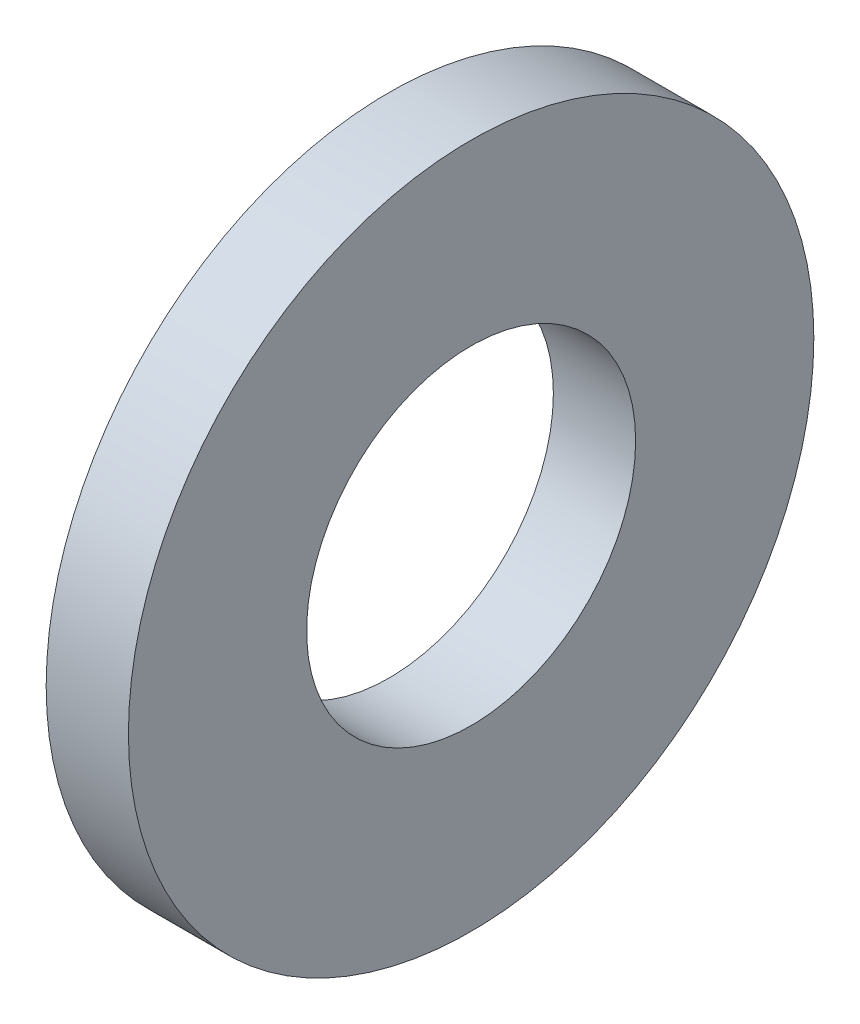
ISO-10303-21;
HEADER;
FILE_DESCRIPTION(('STEP AP214'),'2;1');
FILE_NAME('part.step','',(''),(''),'','','');
FILE_SCHEMA(('AUTOMOTIVE_DESIGN { 1 0 10303 214 1 1 1 1 }'));
ENDSEC;
DATA;
#1=APPLICATION_CONTEXT('core data for automotive mechanical design processes');
#2=APPLICATION_PROTOCOL_DEFINITION('international standard','automotive_design',2000,#1);
#3=PRODUCT_CONTEXT('',#1,'mechanical');
#4=PRODUCT('Part','Part','',(#3));
#5=PRODUCT_RELATED_PRODUCT_CATEGORY('part','',(#4));
#6=PRODUCT_DEFINITION_FORMATION('','',#4);
#7=PRODUCT_DEFINITION_CONTEXT('part definition',#1,'design');
#8=PRODUCT_DEFINITION('design','',#6,#7);
#9=PRODUCT_DEFINITION_SHAPE('','',#8);
#10=(LENGTH_UNIT() NAMED_UNIT(*) SI_UNIT(.MILLI.,.METRE.));
#11=(NAMED_UNIT(*) PLANE_ANGLE_UNIT() SI_UNIT($,.RADIAN.));
#12=(NAMED_UNIT(*) SI_UNIT($,.STERADIAN.) SOLID_ANGLE_UNIT());
#13=UNCERTAINTY_MEASURE_WITH_UNIT(LENGTH_MEASURE(1.E-05),#10,'distance_accuracy_value','');
#14=(GEOMETRIC_REPRESENTATION_CONTEXT(3) GLOBAL_UNCERTAINTY_ASSIGNED_CONTEXT((#13)) GLOBAL_UNIT_ASSIGNED_CONTEXT((#10,
#11,#12)) REPRESENTATION_CONTEXT('',''));
#15=CARTESIAN_POINT('',(0.,0.,0.));
#16=DIRECTION('',(0.,0.,1.));
#17=DIRECTION('',(1.,0.,0.));
#18=AXIS2_PLACEMENT_3D('',#15,#16,#17);
#19=CARTESIAN_POINT('',(3.,0.,0.));
#20=DIRECTION('',(1.,0.,0.));
#21=DIRECTION('',(0.,0.,-1.));
#22=AXIS2_PLACEMENT_3D('',#19,#20,#21);
#23=PLANE('',#22);
#24=CARTESIAN_POINT('',(3.,0.,0.));
#25=DIRECTION('',(1.,0.,0.));
#26=DIRECTION('',(0.,0.,-1.));
#27=AXIS2_PLACEMENT_3D('',#24,#25,#26);
#28=CIRCLE('',#27,12.5);
#29=CARTESIAN_POINT('',(3.,0.,-12.5));
#30=VERTEX_POINT('',#29);
#31=EDGE_CURVE('E10',#30,#30,#28,.T.);
#32=ORIENTED_EDGE('',*,*,#31,.T.);
#33=EDGE_LOOP('',(#32));
#34=FACE_BOUND('',#33,.T.);
#35=CARTESIAN_POINT('',(3.,0.,0.));
#36=DIRECTION('',(1.,0.,0.));
#37=DIRECTION('',(0.,0.,-1.));
#38=AXIS2_PLACEMENT_3D('',#35,#36,#37);
#39=CIRCLE('',#38,6.);
#40=CARTESIAN_POINT('',(3.,0.,-6.));
#41=VERTEX_POINT('',#40);
#42=EDGE_CURVE('E42',#41,#41,#39,.T.);
#43=ORIENTED_EDGE('',*,*,#42,.F.);
#44=EDGE_LOOP('',(#43));
#45=FACE_BOUND('',#44,.T.);
#46=ADVANCED_FACE('F31',(#34,#45),#23,.T.);
#47=CARTESIAN_POINT('',(0.,0.,0.));
#48=DIRECTION('',(1.,0.,0.));
#49=DIRECTION('',(0.,0.,-1.));
#50=AXIS2_PLACEMENT_3D('',#47,#48,#49);
#51=PLANE('',#50);
#52=CARTESIAN_POINT('',(0.,0.,0.));
#53=DIRECTION('',(1.,0.,0.));
#54=DIRECTION('',(0.,0.,-1.));
#55=AXIS2_PLACEMENT_3D('',#52,#53,#54);
#56=CIRCLE('',#55,12.5);
#57=CARTESIAN_POINT('',(0.,0.,-12.5));
#58=VERTEX_POINT('',#57);
#59=EDGE_CURVE('E35',#58,#58,#56,.T.);
#60=ORIENTED_EDGE('',*,*,#59,.F.);
#61=EDGE_LOOP('',(#60));
#62=FACE_BOUND('',#61,.T.);
#63=CARTESIAN_POINT('',(0.,0.,0.));
#64=DIRECTION('',(1.,0.,0.));
#65=DIRECTION('',(0.,0.,-1.));
#66=AXIS2_PLACEMENT_3D('',#63,#64,#65);
#67=CIRCLE('',#66,6.);
#68=CARTESIAN_POINT('',(0.,0.,-6.));
#69=VERTEX_POINT('',#68);
#70=EDGE_CURVE('E44',#69,#69,#67,.T.);
#71=ORIENTED_EDGE('',*,*,#70,.T.);
#72=EDGE_LOOP('',(#71));
#73=FACE_BOUND('',#72,.T.);
#74=ADVANCED_FACE('F54',(#62,#73),#51,.F.);
#75=CARTESIAN_POINT('',(3.,0.,0.));
#76=DIRECTION('',(-1.,0.,0.));
#77=DIRECTION('',(0.,0.,1.));
#78=AXIS2_PLACEMENT_3D('',#75,#76,#77);
#79=CYLINDRICAL_SURFACE('',#78,12.5);
#80=ORIENTED_EDGE('',*,*,#31,.F.);
#81=EDGE_LOOP('',(#80));
#82=FACE_BOUND('',#81,.T.);
#83=ORIENTED_EDGE('',*,*,#59,.T.);
#84=EDGE_LOOP('',(#83));
#85=FACE_BOUND('',#84,.T.);
#86=ADVANCED_FACE('F33',(#82,#85),#79,.T.);
#87=CARTESIAN_POINT('',(3.,0.,0.));
#88=DIRECTION('',(-1.,0.,0.));
#89=DIRECTION('',(0.,0.,1.));
#90=AXIS2_PLACEMENT_3D('',#87,#88,#89);
#91=CYLINDRICAL_SURFACE('',#90,6.);
#92=ORIENTED_EDGE('',*,*,#42,.T.);
#93=EDGE_LOOP('',(#92));
#94=FACE_BOUND('',#93,.T.);
#95=ORIENTED_EDGE('',*,*,#70,.F.);
#96=EDGE_LOOP('',(#95));
#97=FACE_BOUND('',#96,.T.);
#98=ADVANCED_FACE('F50',(#94,#97),#91,.F.);
#99=CLOSED_SHELL('',(#46,#74,#86,#98));
#100=MANIFOLD_SOLID_BREP('B2',#99);
#101=ADVANCED_BREP_SHAPE_REPRESENTATION('',(#18,#100),#14);
#102=SHAPE_DEFINITION_REPRESENTATION(#9,#101);
ENDSEC;
END-ISO-10303-21;
